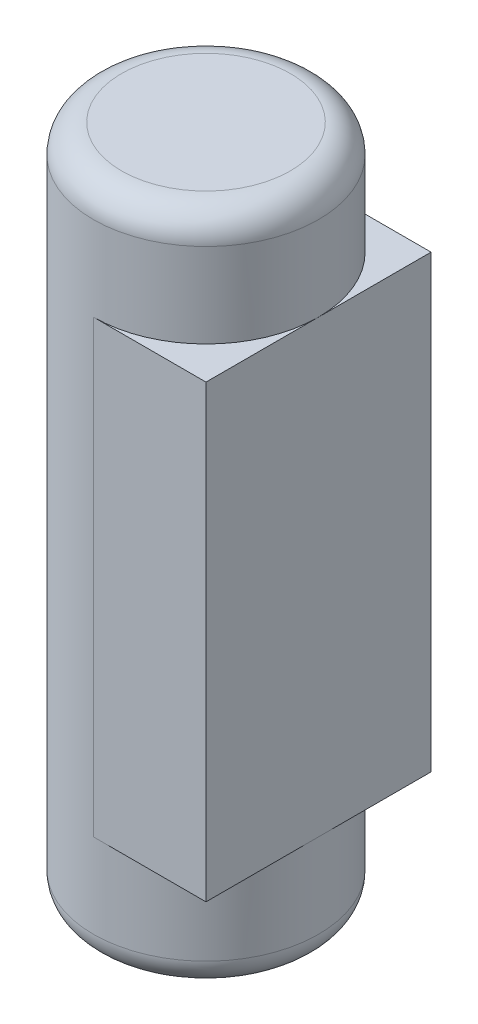
ISO-10303-21;
HEADER;
FILE_DESCRIPTION(('STEP AP214'),'2;1');
FILE_NAME('part.step','',(''),(''),'','','');
FILE_SCHEMA(('AUTOMOTIVE_DESIGN { 1 0 10303 214 1 1 1 1 }'));
ENDSEC;
DATA;
#1=APPLICATION_CONTEXT('core data for automotive mechanical design processes');
#2=APPLICATION_PROTOCOL_DEFINITION('international standard','automotive_design',2000,#1);
#3=PRODUCT_CONTEXT('',#1,'mechanical');
#4=PRODUCT('Part','Part','',(#3));
#5=PRODUCT_RELATED_PRODUCT_CATEGORY('part','',(#4));
#6=PRODUCT_DEFINITION_FORMATION('','',#4);
#7=PRODUCT_DEFINITION_CONTEXT('part definition',#1,'design');
#8=PRODUCT_DEFINITION('design','',#6,#7);
#9=PRODUCT_DEFINITION_SHAPE('','',#8);
#10=(LENGTH_UNIT() NAMED_UNIT(*) SI_UNIT(.MILLI.,.METRE.));
#11=(NAMED_UNIT(*) PLANE_ANGLE_UNIT() SI_UNIT($,.RADIAN.));
#12=(NAMED_UNIT(*) SI_UNIT($,.STERADIAN.) SOLID_ANGLE_UNIT());
#13=UNCERTAINTY_MEASURE_WITH_UNIT(LENGTH_MEASURE(1.E-05),#10,'distance_accuracy_value','');
#14=(GEOMETRIC_REPRESENTATION_CONTEXT(3) GLOBAL_UNCERTAINTY_ASSIGNED_CONTEXT((#13)) GLOBAL_UNIT_ASSIGNED_CONTEXT((#10,
#11,#12)) REPRESENTATION_CONTEXT('',''));
#15=CARTESIAN_POINT('',(0.,0.,0.));
#16=DIRECTION('',(0.,0.,1.));
#17=DIRECTION('',(1.,0.,0.));
#18=AXIS2_PLACEMENT_3D('',#15,#16,#17);
#19=CARTESIAN_POINT('',(0.,304.8,0.));
#20=DIRECTION('',(0.,-1.,0.));
#21=DIRECTION('',(0.,0.,-1.));
#22=AXIS2_PLACEMENT_3D('',#19,#20,#21);
#23=CYLINDRICAL_SURFACE('',#22,50.8);
#24=CARTESIAN_POINT('',(0.,12.6999999999999,0.));
#25=DIRECTION('',(0.,1.,0.));
#26=DIRECTION('',(0.,0.,1.));
#27=AXIS2_PLACEMENT_3D('',#24,#25,#26);
#28=CIRCLE('',#27,50.8);
#29=CARTESIAN_POINT('',(0.,12.6999999999999,50.8));
#30=VERTEX_POINT('',#29);
#31=EDGE_CURVE('E130',#30,#30,#28,.T.);
#32=ORIENTED_EDGE('',*,*,#31,.T.);
#33=EDGE_LOOP('',(#32));
#34=FACE_BOUND('',#33,.T.);
#35=CARTESIAN_POINT('',(0.,292.1,0.));
#36=DIRECTION('',(0.,1.,0.));
#37=DIRECTION('',(0.,0.,1.));
#38=AXIS2_PLACEMENT_3D('',#35,#36,#37);
#39=CIRCLE('',#38,50.8);
#40=CARTESIAN_POINT('',(0.,292.1,50.8));
#41=VERTEX_POINT('',#40);
#42=EDGE_CURVE('E127',#41,#41,#39,.F.);
#43=ORIENTED_EDGE('',*,*,#42,.T.);
#44=EDGE_LOOP('',(#43));
#45=FACE_BOUND('',#44,.T.);
#46=CARTESIAN_POINT('',(0.,254.,0.));
#47=DIRECTION('',(0.,-1.,0.));
#48=DIRECTION('',(0.,0.,-1.));
#49=AXIS2_PLACEMENT_3D('',#46,#47,#48);
#50=CIRCLE('',#49,50.8);
#51=CARTESIAN_POINT('',(0.,254.,-50.8));
#52=VERTEX_POINT('',#51);
#53=CARTESIAN_POINT('',(50.8,254.,0.));
#54=VERTEX_POINT('',#53);
#55=EDGE_CURVE('E126',#52,#54,#50,.T.);
#56=ORIENTED_EDGE('',*,*,#55,.F.);
#57=DIRECTION('',(0.,1.,0.));
#58=VECTOR('',#57,1.);
#59=CARTESIAN_POINT('',(0.,50.8000000000002,-50.8));
#60=LINE('',#59,#58);
#61=CARTESIAN_POINT('',(0.,50.8000000000002,-50.8));
#62=VERTEX_POINT('',#61);
#63=EDGE_CURVE('E96',#62,#52,#60,.T.);
#64=ORIENTED_EDGE('',*,*,#63,.F.);
#65=CARTESIAN_POINT('',(0.,50.8000000000002,0.));
#66=DIRECTION('',(0.,-1.,0.));
#67=DIRECTION('',(0.,0.,-1.));
#68=AXIS2_PLACEMENT_3D('',#65,#66,#67);
#69=CIRCLE('',#68,50.8);
#70=CARTESIAN_POINT('',(50.8,50.8000000000002,0.));
#71=VERTEX_POINT('',#70);
#72=EDGE_CURVE('E124',#62,#71,#69,.T.);
#73=ORIENTED_EDGE('',*,*,#72,.T.);
#74=CARTESIAN_POINT('',(0.,50.8000000000002,50.8));
#75=VERTEX_POINT('',#74);
#76=EDGE_CURVE('E62',#71,#75,#69,.T.);
#77=ORIENTED_EDGE('',*,*,#76,.T.);
#78=DIRECTION('',(0.,1.,0.));
#79=VECTOR('',#78,1.);
#80=CARTESIAN_POINT('',(0.,50.8000000000002,50.8));
#81=LINE('',#80,#79);
#82=CARTESIAN_POINT('',(0.,254.,50.8));
#83=VERTEX_POINT('',#82);
#84=EDGE_CURVE('E114',#75,#83,#81,.T.);
#85=ORIENTED_EDGE('',*,*,#84,.T.);
#86=EDGE_CURVE('E99',#54,#83,#50,.T.);
#87=ORIENTED_EDGE('',*,*,#86,.F.);
#88=EDGE_LOOP('',(#56,#64,#73,#77,#85,#87));
#89=FACE_BOUND('',#88,.T.);
#90=ADVANCED_FACE('F39',(#34,#45,#89),#23,.T.);
#91=CARTESIAN_POINT('',(0.,304.8,0.));
#92=DIRECTION('',(0.,1.,0.));
#93=DIRECTION('',(0.,0.,1.));
#94=AXIS2_PLACEMENT_3D('',#91,#92,#93);
#95=PLANE('',#94);
#96=CARTESIAN_POINT('',(0.,304.8,0.));
#97=DIRECTION('',(0.,1.,0.));
#98=DIRECTION('',(0.,0.,1.));
#99=AXIS2_PLACEMENT_3D('',#96,#97,#98);
#100=CIRCLE('',#99,38.1);
#101=CARTESIAN_POINT('',(0.,304.8,38.1));
#102=VERTEX_POINT('',#101);
#103=EDGE_CURVE('E11',#102,#102,#100,.T.);
#104=ORIENTED_EDGE('',*,*,#103,.T.);
#105=EDGE_LOOP('',(#104));
#106=FACE_BOUND('',#105,.T.);
#107=ADVANCED_FACE('F145',(#106),#95,.T.);
#108=CARTESIAN_POINT('',(0.,0.,0.));
#109=DIRECTION('',(0.,1.,0.));
#110=DIRECTION('',(0.,0.,1.));
#111=AXIS2_PLACEMENT_3D('',#108,#109,#110);
#112=PLANE('',#111);
#113=CARTESIAN_POINT('',(0.,0.,0.));
#114=DIRECTION('',(0.,1.,0.));
#115=DIRECTION('',(0.,0.,1.));
#116=AXIS2_PLACEMENT_3D('',#113,#114,#115);
#117=CIRCLE('',#116,38.1);
#118=CARTESIAN_POINT('',(0.,0.,38.1));
#119=VERTEX_POINT('',#118);
#120=EDGE_CURVE('E47',#119,#119,#117,.F.);
#121=ORIENTED_EDGE('',*,*,#120,.T.);
#122=EDGE_LOOP('',(#121));
#123=FACE_BOUND('',#122,.T.);
#124=ADVANCED_FACE('F135',(#123),#112,.F.);
#125=CARTESIAN_POINT('',(50.8,254.,-50.8));
#126=DIRECTION('',(0.,-1.,0.));
#127=DIRECTION('',(0.,0.,-1.));
#128=AXIS2_PLACEMENT_3D('',#125,#126,#127);
#129=PLANE('',#128);
#130=DIRECTION('',(-1.,0.,0.));
#131=VECTOR('',#130,1.);
#132=CARTESIAN_POINT('',(50.8,254.,-50.8));
#133=LINE('',#132,#131);
#134=CARTESIAN_POINT('',(50.8,254.,-50.8));
#135=VERTEX_POINT('',#134);
#136=EDGE_CURVE('E113',#135,#52,#133,.T.);
#137=ORIENTED_EDGE('',*,*,#136,.T.);
#138=ORIENTED_EDGE('',*,*,#55,.T.);
#139=DIRECTION('',(0.,0.,1.));
#140=VECTOR('',#139,1.);
#141=CARTESIAN_POINT('',(50.8,254.,-50.8));
#142=LINE('',#141,#140);
#143=EDGE_CURVE('E93',#135,#54,#142,.T.);
#144=ORIENTED_EDGE('',*,*,#143,.F.);
#145=EDGE_LOOP('',(#137,#138,#144));
#146=FACE_BOUND('',#145,.T.);
#147=ADVANCED_FACE('F153',(#146),#129,.F.);
#148=CARTESIAN_POINT('',(50.8,50.8000000000002,-50.8));
#149=DIRECTION('',(0.,-1.,0.));
#150=DIRECTION('',(0.,0.,-1.));
#151=AXIS2_PLACEMENT_3D('',#148,#149,#150);
#152=PLANE('',#151);
#153=ORIENTED_EDGE('',*,*,#72,.F.);
#154=DIRECTION('',(-1.,0.,0.));
#155=VECTOR('',#154,1.);
#156=CARTESIAN_POINT('',(50.8,50.8000000000002,-50.8));
#157=LINE('',#156,#155);
#158=CARTESIAN_POINT('',(50.8,50.8000000000002,-50.8));
#159=VERTEX_POINT('',#158);
#160=EDGE_CURVE('E119',#159,#62,#157,.T.);
#161=ORIENTED_EDGE('',*,*,#160,.F.);
#162=DIRECTION('',(0.,0.,1.));
#163=VECTOR('',#162,1.);
#164=CARTESIAN_POINT('',(50.8,50.8000000000002,-50.8));
#165=LINE('',#164,#163);
#166=EDGE_CURVE('E107',#159,#71,#165,.T.);
#167=ORIENTED_EDGE('',*,*,#166,.T.);
#168=EDGE_LOOP('',(#153,#161,#167));
#169=FACE_BOUND('',#168,.T.);
#170=ADVANCED_FACE('F159',(#169),#152,.T.);
#171=CARTESIAN_POINT('',(50.8,0.,0.));
#172=DIRECTION('',(-1.,0.,0.));
#173=DIRECTION('',(0.,0.,1.));
#174=AXIS2_PLACEMENT_3D('',#171,#172,#173);
#175=PLANE('',#174);
#176=ORIENTED_EDGE('',*,*,#143,.T.);
#177=CARTESIAN_POINT('',(50.8,254.,50.8));
#178=VERTEX_POINT('',#177);
#179=EDGE_CURVE('E89',#54,#178,#142,.T.);
#180=ORIENTED_EDGE('',*,*,#179,.T.);
#181=DIRECTION('',(0.,1.,0.));
#182=VECTOR('',#181,1.);
#183=CARTESIAN_POINT('',(50.8,50.8000000000002,50.8));
#184=LINE('',#183,#182);
#185=CARTESIAN_POINT('',(50.8,50.8000000000002,50.8));
#186=VERTEX_POINT('',#185);
#187=EDGE_CURVE('E91',#186,#178,#184,.T.);
#188=ORIENTED_EDGE('',*,*,#187,.F.);
#189=EDGE_CURVE('E105',#71,#186,#165,.T.);
#190=ORIENTED_EDGE('',*,*,#189,.F.);
#191=ORIENTED_EDGE('',*,*,#166,.F.);
#192=DIRECTION('',(0.,1.,0.));
#193=VECTOR('',#192,1.);
#194=CARTESIAN_POINT('',(50.8,50.8000000000002,-50.8));
#195=LINE('',#194,#193);
#196=EDGE_CURVE('E111',#159,#135,#195,.T.);
#197=ORIENTED_EDGE('',*,*,#196,.T.);
#198=EDGE_LOOP('',(#176,#180,#188,#190,#191,#197));
#199=FACE_BOUND('',#198,.T.);
#200=ADVANCED_FACE('F90',(#199),#175,.F.);
#201=ORIENTED_EDGE('',*,*,#179,.F.);
#202=ORIENTED_EDGE('',*,*,#86,.T.);
#203=DIRECTION('',(-1.,0.,0.));
#204=VECTOR('',#203,1.);
#205=CARTESIAN_POINT('',(50.8,254.,50.8));
#206=LINE('',#205,#204);
#207=EDGE_CURVE('E54',#178,#83,#206,.T.);
#208=ORIENTED_EDGE('',*,*,#207,.F.);
#209=EDGE_LOOP('',(#201,#202,#208));
#210=FACE_BOUND('',#209,.T.);
#211=ADVANCED_FACE('F98',(#210),#129,.F.);
#212=CARTESIAN_POINT('',(50.8,50.8000000000002,50.8));
#213=DIRECTION('',(0.,0.,1.));
#214=DIRECTION('',(1.,0.,0.));
#215=AXIS2_PLACEMENT_3D('',#212,#213,#214);
#216=PLANE('',#215);
#217=ORIENTED_EDGE('',*,*,#84,.F.);
#218=DIRECTION('',(-1.,0.,0.));
#219=VECTOR('',#218,1.);
#220=CARTESIAN_POINT('',(50.8,50.8000000000002,50.8));
#221=LINE('',#220,#219);
#222=EDGE_CURVE('E101',#186,#75,#221,.T.);
#223=ORIENTED_EDGE('',*,*,#222,.F.);
#224=ORIENTED_EDGE('',*,*,#187,.T.);
#225=ORIENTED_EDGE('',*,*,#207,.T.);
#226=EDGE_LOOP('',(#217,#223,#224,#225));
#227=FACE_BOUND('',#226,.T.);
#228=ADVANCED_FACE('F104',(#227),#216,.T.);
#229=ORIENTED_EDGE('',*,*,#76,.F.);
#230=ORIENTED_EDGE('',*,*,#189,.T.);
#231=ORIENTED_EDGE('',*,*,#222,.T.);
#232=EDGE_LOOP('',(#229,#230,#231));
#233=FACE_BOUND('',#232,.T.);
#234=ADVANCED_FACE('F160',(#233),#152,.T.);
#235=CARTESIAN_POINT('',(50.8,50.8000000000002,-50.8));
#236=DIRECTION('',(0.,0.,1.));
#237=DIRECTION('',(1.,0.,0.));
#238=AXIS2_PLACEMENT_3D('',#235,#236,#237);
#239=PLANE('',#238);
#240=ORIENTED_EDGE('',*,*,#63,.T.);
#241=ORIENTED_EDGE('',*,*,#136,.F.);
#242=ORIENTED_EDGE('',*,*,#196,.F.);
#243=ORIENTED_EDGE('',*,*,#160,.T.);
#244=EDGE_LOOP('',(#240,#241,#242,#243));
#245=FACE_BOUND('',#244,.T.);
#246=ADVANCED_FACE('F140',(#245),#239,.F.);
#247=CARTESIAN_POINT('',(0.,12.7,0.));
#248=DIRECTION('',(0.,1.,0.));
#249=DIRECTION('',(0.,0.,1.));
#250=AXIS2_PLACEMENT_3D('',#247,#248,#249);
#251=TOROIDAL_SURFACE('',#250,38.1,12.7);
#252=ORIENTED_EDGE('',*,*,#120,.F.);
#253=EDGE_LOOP('',(#252));
#254=FACE_BOUND('',#253,.T.);
#255=ORIENTED_EDGE('',*,*,#31,.F.);
#256=EDGE_LOOP('',(#255));
#257=FACE_BOUND('',#256,.T.);
#258=ADVANCED_FACE('F137',(#254,#257),#251,.T.);
#259=CARTESIAN_POINT('',(0.,292.1,0.));
#260=DIRECTION('',(0.,1.,0.));
#261=DIRECTION('',(0.,0.,1.));
#262=AXIS2_PLACEMENT_3D('',#259,#260,#261);
#263=TOROIDAL_SURFACE('',#262,38.1,12.7);
#264=ORIENTED_EDGE('',*,*,#42,.F.);
#265=EDGE_LOOP('',(#264));
#266=FACE_BOUND('',#265,.T.);
#267=ORIENTED_EDGE('',*,*,#103,.F.);
#268=EDGE_LOOP('',(#267));
#269=FACE_BOUND('',#268,.T.);
#270=ADVANCED_FACE('F41',(#266,#269),#263,.T.);
#271=CLOSED_SHELL('',(#90,#107,#124,#147,#170,#200,#211,#228,#234,#246,#258,#270));
#272=MANIFOLD_SOLID_BREP('B2',#271);
#273=ADVANCED_BREP_SHAPE_REPRESENTATION('',(#18,#272),#14);
#274=SHAPE_DEFINITION_REPRESENTATION(#9,#273);
ENDSEC;
END-ISO-10303-21;
